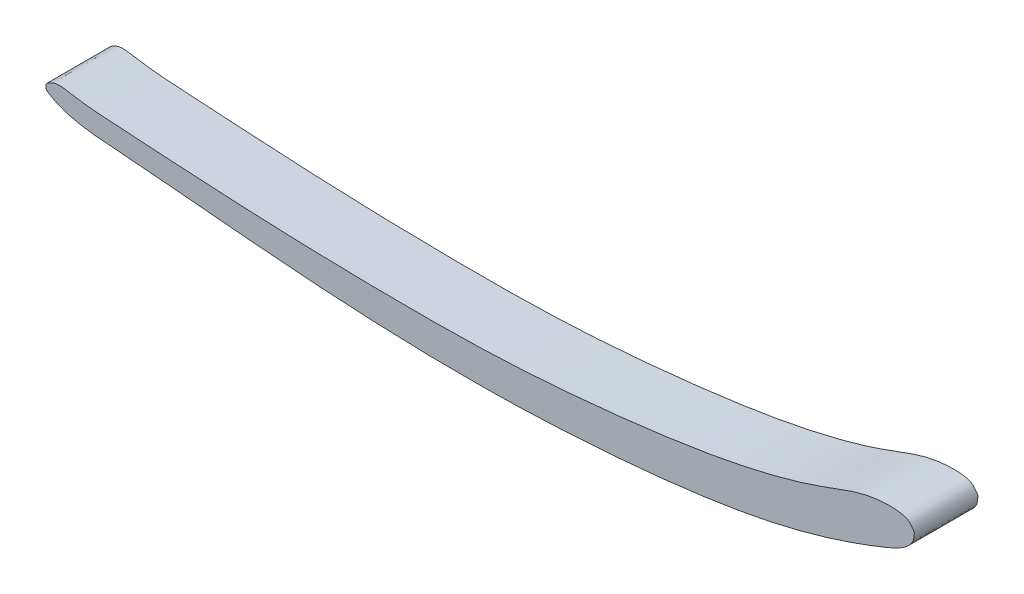
ISO-10303-21;
HEADER;
FILE_DESCRIPTION(('STEP AP214'),'2;1');
FILE_NAME('part.step','',(''),(''),'','','');
FILE_SCHEMA(('AUTOMOTIVE_DESIGN { 1 0 10303 214 1 1 1 1 }'));
ENDSEC;
DATA;
#1=APPLICATION_CONTEXT('core data for automotive mechanical design processes');
#2=APPLICATION_PROTOCOL_DEFINITION('international standard','automotive_design',2000,#1);
#3=PRODUCT_CONTEXT('',#1,'mechanical');
#4=PRODUCT('Part','Part','',(#3));
#5=PRODUCT_RELATED_PRODUCT_CATEGORY('part','',(#4));
#6=PRODUCT_DEFINITION_FORMATION('','',#4);
#7=PRODUCT_DEFINITION_CONTEXT('part definition',#1,'design');
#8=PRODUCT_DEFINITION('design','',#6,#7);
#9=PRODUCT_DEFINITION_SHAPE('','',#8);
#10=(LENGTH_UNIT() NAMED_UNIT(*) SI_UNIT(.MILLI.,.METRE.));
#11=(NAMED_UNIT(*) PLANE_ANGLE_UNIT() SI_UNIT($,.RADIAN.));
#12=(NAMED_UNIT(*) SI_UNIT($,.STERADIAN.) SOLID_ANGLE_UNIT());
#13=UNCERTAINTY_MEASURE_WITH_UNIT(LENGTH_MEASURE(1.E-05),#10,'distance_accuracy_value','');
#14=(GEOMETRIC_REPRESENTATION_CONTEXT(3) GLOBAL_UNCERTAINTY_ASSIGNED_CONTEXT((#13)) GLOBAL_UNIT_ASSIGNED_CONTEXT((#10,
#11,#12)) REPRESENTATION_CONTEXT('',''));
#15=CARTESIAN_POINT('',(0.,0.,0.));
#16=DIRECTION('',(0.,0.,1.));
#17=DIRECTION('',(1.,0.,0.));
#18=AXIS2_PLACEMENT_3D('',#15,#16,#17);
#19=CARTESIAN_POINT('',(36.7262010496488,0.,492.));
#20=CARTESIAN_POINT('',(36.7133797724211,0.0729813604221849,492.));
#21=CARTESIAN_POINT('',(36.67513989734,0.136078291659611,492.));
#22=CARTESIAN_POINT('',(36.5930802891316,0.256964286979581,492.));
#23=CARTESIAN_POINT('',(36.5484626792068,0.314771593384708,492.));
#24=CARTESIAN_POINT('',(36.417875285245,0.490592382841295,492.));
#25=CARTESIAN_POINT('',(36.3318921842273,0.609748889577377,492.));
#26=CARTESIAN_POINT('',(36.1362470533172,0.823987501588429,492.));
#27=CARTESIAN_POINT('',(36.026113092176,0.917294486688997,492.));
#28=CARTESIAN_POINT('',(35.771219217784,1.06506113410336,492.));
#29=CARTESIAN_POINT('',(35.63612750034,1.11829741381301,492.));
#30=CARTESIAN_POINT('',(35.3588698646439,1.20460678963974,492.));
#31=CARTESIAN_POINT('',(35.2158426542222,1.23733972844844,492.));
#32=CARTESIAN_POINT('',(34.9300504604819,1.29113311545856,492.));
#33=CARTESIAN_POINT('',(34.7868633243137,1.31219111687383,492.));
#34=CARTESIAN_POINT('',(34.3565254255757,1.35978754306366,492.));
#35=CARTESIAN_POINT('',(34.0686455554712,1.37169895896495,492.));
#36=CARTESIAN_POINT('',(33.2036087151918,1.37940264309321,492.));
#37=CARTESIAN_POINT('',(32.6222386610464,1.34304315842364,492.));
#38=CARTESIAN_POINT('',(31.4801425739763,1.20827698119862,492.));
#39=CARTESIAN_POINT('',(30.9171817157749,1.10786928119019,492.));
#40=CARTESIAN_POINT('',(29.2517745424601,0.710782667102273,492.));
#41=CARTESIAN_POINT('',(28.1710752271875,0.325189470773035,492.));
#42=CARTESIAN_POINT('',(26.5547430216561,-0.27212932680263,492.));
#43=CARTESIAN_POINT('',(26.0166577938437,-0.473666841823692,492.));
#44=CARTESIAN_POINT('',(24.9370128675374,-0.864537854449624,492.));
#45=CARTESIAN_POINT('',(24.3958332793909,-1.05520648299194,492.));
#46=CARTESIAN_POINT('',(22.7646803572177,-1.60046777293582,492.));
#47=CARTESIAN_POINT('',(21.6668516003385,-1.9274683991486,492.));
#48=CARTESIAN_POINT('',(19.457001129466,-2.53161713828822,492.));
#49=CARTESIAN_POINT('',(18.3451317724488,-2.80930040242567,492.));
#50=CARTESIAN_POINT('',(16.1113814923126,-3.32950148011149,492.));
#51=CARTESIAN_POINT('',(14.9889144466648,-3.57154776048857,492.));
#52=CARTESIAN_POINT('',(12.7352509971393,-4.01780116655661,492.));
#53=CARTESIAN_POINT('',(11.6051903979895,-4.22234051754887,492.));
#54=CARTESIAN_POINT('',(8.20755388742425,-4.7930447372641,492.));
#55=CARTESIAN_POINT('',(5.93270816837034,-5.1183275838422,492.));
#56=CARTESIAN_POINT('',(1.37698305627379,-5.70110088672263,492.));
#57=CARTESIAN_POINT('',(-0.905044220746151,-5.9571115781388,492.));
#58=CARTESIAN_POINT('',(-5.47608147948668,-6.40982049225298,492.));
#59=CARTESIAN_POINT('',(-7.76507349780216,-6.60712892709716,492.));
#60=CARTESIAN_POINT('',(-12.3477937812769,-6.9278693476001,492.));
#61=CARTESIAN_POINT('',(-14.641960047548,-7.04899605573451,492.));
#62=CARTESIAN_POINT('',(-19.2313471286655,-7.20779369924017,492.));
#63=CARTESIAN_POINT('',(-21.5271553841849,-7.24648259675405,492.));
#64=CARTESIAN_POINT('',(-26.1201831567125,-7.27232044630014,492.));
#65=CARTESIAN_POINT('',(-28.4171087602292,-7.26034154270508,492.));
#66=CARTESIAN_POINT('',(-33.0099241994059,-7.20662342549448,492.));
#67=CARTESIAN_POINT('',(-35.3061215876952,-7.16502147347035,492.));
#68=CARTESIAN_POINT('',(-39.8979941578567,-7.04521420327862,492.));
#69=CARTESIAN_POINT('',(-42.1934095141933,-6.9659721273405,492.));
#70=CARTESIAN_POINT('',(-49.0769555280264,-6.6756878402906,492.));
#71=CARTESIAN_POINT('',(-53.6628113274282,-6.40796296634062,492.));
#72=CARTESIAN_POINT('',(-59.39445231446,-6.06671721522193,492.));
#73=CARTESIAN_POINT('',(-60.5407210543964,-5.99747576330353,492.));
#74=CARTESIAN_POINT('',(-62.2599339874662,-5.89050824881909,492.));
#75=CARTESIAN_POINT('',(-62.8329301402781,-5.8536731978304,492.));
#76=CARTESIAN_POINT('',(-63.9788443151999,-5.77884108443333,492.));
#77=CARTESIAN_POINT('',(-64.5518752660169,-5.74255292116659,492.));
#78=CARTESIAN_POINT('',(-65.6974797314219,-5.66299154351626,492.));
#79=CARTESIAN_POINT('',(-66.2698761172291,-5.61897610933982,492.));
#80=CARTESIAN_POINT('',(-67.4110953963833,-5.50216477965581,492.));
#81=CARTESIAN_POINT('',(-67.9797927650533,-5.42793003678991,492.));
#82=CARTESIAN_POINT('',(-69.1125449764886,-5.24103142237363,492.));
#83=CARTESIAN_POINT('',(-69.6763377465336,-5.12201462321532,492.));
#84=CARTESIAN_POINT('',(-70.3892899799784,-5.06426097505116,492.));
#85=CARTESIAN_POINT('',(-70.5323091179331,-5.05757735164672,492.));
#86=CARTESIAN_POINT('',(-70.8199094070894,-5.06194427628034,492.));
#87=CARTESIAN_POINT('',(-70.9657323749074,-5.07338825264403,492.));
#88=CARTESIAN_POINT('',(-71.2477713224917,-5.12390379627729,492.));
#89=CARTESIAN_POINT('',(-71.3844782759016,-5.16440800205834,492.));
#90=CARTESIAN_POINT('',(-71.6502130784592,-5.27256502873785,492.));
#91=CARTESIAN_POINT('',(-71.7802061125209,-5.33787863187121,492.));
#92=CARTESIAN_POINT('',(-71.9694655812472,-5.44422989080409,492.));
#93=CARTESIAN_POINT('',(-72.0327138706296,-5.47968313219667,492.));
#94=CARTESIAN_POINT('',(-72.1248965817004,-5.53658783990071,492.));
#95=CARTESIAN_POINT('',(-72.1547450272689,-5.55681451004528,492.));
#96=CARTESIAN_POINT('',(-72.209366928061,-5.60453250914638,492.));
#97=CARTESIAN_POINT('',(-72.2340820680282,-5.63318494143246,492.));
#98=CARTESIAN_POINT('',(-72.2924392748385,-5.72618514481274,492.));
#99=CARTESIAN_POINT('',(-72.3128511792452,-5.79931584357966,492.));
#100=CARTESIAN_POINT('',(-72.3232724789684,-5.94620827564578,492.));
#101=CARTESIAN_POINT('',(-72.3194729880737,-6.02037282297193,492.));
#102=CARTESIAN_POINT('',(-72.3073433554358,-6.16678710597583,492.));
#103=CARTESIAN_POINT('',(-72.2960879904276,-6.24107832333309,492.));
#104=CARTESIAN_POINT('',(-72.2529271733587,-6.34387914655428,492.));
#105=CARTESIAN_POINT('',(-72.2339038151388,-6.37662583625055,492.));
#106=CARTESIAN_POINT('',(-72.1852803225318,-6.43305369071682,492.));
#107=CARTESIAN_POINT('',(-72.1566201468351,-6.45689915138685,492.));
#108=CARTESIAN_POINT('',(-72.0645871562647,-6.52100202513553,492.));
#109=CARTESIAN_POINT('',(-71.9973345991958,-6.55326933618474,492.));
#110=CARTESIAN_POINT('',(-71.8653447752185,-6.62226874965908,492.));
#111=CARTESIAN_POINT('',(-71.8003441060631,-6.65853329724755,492.));
#112=CARTESIAN_POINT('',(-71.6068389992752,-6.76998402878294,492.));
#113=CARTESIAN_POINT('',(-71.4798062473522,-6.84820703957239,492.));
#114=CARTESIAN_POINT('',(-71.2229969001249,-6.99891261616082,492.));
#115=CARTESIAN_POINT('',(-71.09264775562,-7.06988767577825,492.));
#116=CARTESIAN_POINT('',(-70.6930560851211,-7.26357659275841,492.));
#117=CARTESIAN_POINT('',(-70.4170256848119,-7.37100841520982,492.));
#118=CARTESIAN_POINT('',(-69.8554019439027,-7.56434231742882,492.));
#119=CARTESIAN_POINT('',(-69.5693284535494,-7.65090194172303,492.));
#120=CARTESIAN_POINT('',(-68.9961028679899,-7.80423303785446,492.));
#121=CARTESIAN_POINT('',(-68.7081700693623,-7.87110286877489,492.));
#122=CARTESIAN_POINT('',(-67.8410240006993,-8.04686939913117,492.));
#123=CARTESIAN_POINT('',(-67.2585255746495,-8.13138707089148,492.));
#124=CARTESIAN_POINT('',(-66.0897616207517,-8.27246688396162,492.));
#125=CARTESIAN_POINT('',(-65.5034630773655,-8.32878401811952,492.));
#126=CARTESIAN_POINT('',(-64.3293656553721,-8.43028435133014,492.));
#127=CARTESIAN_POINT('',(-63.7416806505301,-8.47631260360354,492.));
#128=CARTESIAN_POINT('',(-61.9781855162873,-8.61113124742806,492.));
#129=CARTESIAN_POINT('',(-60.8022675303859,-8.69897786281144,492.));
#130=CARTESIAN_POINT('',(-57.2762797832662,-8.98261331393062,492.));
#131=CARTESIAN_POINT('',(-54.9276024583799,-9.19593057339605,492.));
#132=CARTESIAN_POINT('',(-50.2304589700187,-9.62445450304175,492.));
#133=CARTESIAN_POINT('',(-47.8818973024028,-9.83883279038151,492.));
#134=CARTESIAN_POINT('',(-40.8318587061873,-10.431710351713,492.));
#135=CARTESIAN_POINT('',(-36.1261639676439,-10.7609409395558,492.));
#136=CARTESIAN_POINT('',(-26.7036833257857,-11.1904512676192,492.));
#137=CARTESIAN_POINT('',(-21.986751810886,-11.2939342214098,492.));
#138=CARTESIAN_POINT('',(-12.5557765174126,-11.2060826570774,492.));
#139=CARTESIAN_POINT('',(-7.84093091966973,-11.0114473958237,492.));
#140=CARTESIAN_POINT('',(-0.785320613785473,-10.5086414816244,492.));
#141=CARTESIAN_POINT('',(1.56526053661073,-10.3056462427037,492.));
#142=CARTESIAN_POINT('',(6.25618945869852,-9.82487260858937,492.));
#143=CARTESIAN_POINT('',(8.59696899828266,-9.54725947275499,492.));
#144=CARTESIAN_POINT('',(13.2644761374769,-8.88037668744046,492.));
#145=CARTESIAN_POINT('',(15.5933352344576,-8.4910307309868,492.));
#146=CARTESIAN_POINT('',(20.2139385129581,-7.5457783292045,492.));
#147=CARTESIAN_POINT('',(22.5082008971532,-6.9860885791373,492.));
#148=CARTESIAN_POINT('',(27.0374312138603,-5.66483699122295,492.));
#149=CARTESIAN_POINT('',(29.2733048666094,-4.90335386497508,492.));
#150=CARTESIAN_POINT('',(32.0314837674947,-3.85732114832945,492.));
#151=CARTESIAN_POINT('',(32.5815062879098,-3.64356768469349,492.));
#152=CARTESIAN_POINT('',(33.3993190400801,-3.30540064756832,492.));
#153=CARTESIAN_POINT('',(33.6703943712711,-3.18923687375497,492.));
#154=CARTESIAN_POINT('',(34.2069639012786,-2.94434681684933,492.));
#155=CARTESIAN_POINT('',(34.4733575904017,-2.81598081880883,492.));
#156=CARTESIAN_POINT('',(34.9916494511295,-2.53720482629325,492.));
#157=CARTESIAN_POINT('',(35.2434384528101,-2.38660069014345,492.));
#158=CARTESIAN_POINT('',(35.722006187157,-2.0472625557671,492.));
#159=CARTESIAN_POINT('',(35.9504620101233,-1.85501034270215,492.));
#160=CARTESIAN_POINT('',(36.2506621302016,-1.5277247154602,492.));
#161=CARTESIAN_POINT('',(36.3440037389118,-1.41287380451737,492.));
#162=CARTESIAN_POINT('',(36.5068422641124,-1.16276440793578,492.));
#163=CARTESIAN_POINT('',(36.5743745085188,-1.03126283993901,492.));
#164=CARTESIAN_POINT('',(36.6592988621814,-0.747215015619838,492.));
#165=CARTESIAN_POINT('',(36.6721568019822,-0.595707105208426,492.));
#166=CARTESIAN_POINT('',(36.6927489836609,-0.372351500355764,492.));
#167=CARTESIAN_POINT('',(36.7026695849396,-0.298224068369563,492.));
#168=CARTESIAN_POINT('',(36.7192654040829,-0.187214950157583,492.));
#169=CARTESIAN_POINT('',(36.7251427815422,-0.150248577218497,492.));
#170=CARTESIAN_POINT('',(36.7320624155242,-0.0758026077712602,492.));
#171=CARTESIAN_POINT('',(36.7326116882626,-0.036490680211089,492.));
#172=CARTESIAN_POINT('',(36.7262010496488,0.,492.));
#173=B_SPLINE_CURVE_WITH_KNOTS('',3,(#19,#20,#21,#22,#23,#24,#25,#26,#27,#28,#29,#30,#31,#32,
#33,#34,#35,#36,#37,#38,#39,#40,#41,#42,#43,#44,#45,#46,#47,#48,#49,#50,#51,#52,#53,#54,#55,#56,
#57,#58,#59,#60,#61,#62,#63,#64,#65,#66,#67,#68,#69,#70,#71,#72,#73,#74,#75,#76,#77,#78,#79,#80,
#81,#82,#83,#84,#85,#86,#87,#88,#89,#90,#91,#92,#93,#94,#95,#96,#97,#98,#99,#100,#101,#102,#103,
#104,#105,#106,#107,#108,#109,#110,#111,#112,#113,#114,#115,#116,#117,#118,#119,#120,#121,#122,
#123,#124,#125,#126,#127,#128,#129,#130,#131,#132,#133,#134,#135,#136,#137,#138,#139,#140,#141,
#142,#143,#144,#145,#146,#147,#148,#149,#150,#151,#152,#153,#154,#155,#156,#157,#158,#159,#160,
#161,#162,#163,#164,#165,#166,#167,#168,#169,#170,#171,#172),.UNSPECIFIED.,.T.,.F.,(4,2,2,2,2,2,
2,2,2,2,2,2,2,2,2,2,2,2,2,2,2,2,2,2,2,2,2,2,2,2,2,2,2,2,2,2,2,2,2,2,2,2,2,2,2,2,2,2,2,2,2,2,2,2,
2,2,2,2,2,2,2,2,2,2,2,2,2,2,2,2,2,2,2,2,2,2,4),(0.,0.000976562499999904,0.00195312499999981,
0.00390624999999962,0.00585937499999942,0.00781249999999923,0.00976562499999904,
0.0117187499999988,0.0156249999999984,0.0234374999999974,0.0312499999999965,0.0468749999999946,
0.0546874999999937,0.0624999999999927,0.0781249999999909,0.0937499999999891,0.109374999999987,
0.124999999999986,0.156249999999982,0.187499999999978,0.218749999999975,0.249999999999971,
0.281249999999968,0.312499999999964,0.343749999999961,0.374999999999957,0.43749999999995,
0.453124999999948,0.460937499999947,0.468749999999946,0.476562499999945,0.484374999999944,
0.492187499999943,0.494140624999943,0.496093749999943,0.498046874999943,0.499999999999943,
0.500976562499942,0.501464843749943,0.501953124999943,0.502929687499943,0.503906249999943,
0.504882812499943,0.505371093749943,0.505859374999943,0.506835937499943,0.507812499999943,
0.509765624999943,0.511718749999943,0.515624999999944,0.519531249999944,0.523437499999945,
0.531249999999946,0.539062499999947,0.546874999999948,0.562499999999949,0.593749999999953,
0.624999999999957,0.687499999999964,0.749999999999971,0.812499999999978,0.843749999999982,
0.874999999999985,0.906249999999989,0.937499999999993,0.968749999999996,0.976562499999997,
0.980468749999998,0.984374999999998,0.988281249999999,0.992187499999999,0.994140624999999,
0.99609375,0.998046875,0.9990234375,0.99951171875,1.),.UNSPECIFIED.);
#174=DIRECTION('',(0.,0.,-1.));
#175=VECTOR('',#174,1.);
#176=SURFACE_OF_LINEAR_EXTRUSION('',#173,#175);
#177=CARTESIAN_POINT('',(36.7262010496488,0.,492.));
#178=CARTESIAN_POINT('',(36.7326116882626,-0.036490680211089,492.));
#179=CARTESIAN_POINT('',(36.7320624155242,-0.0758026077712602,492.));
#180=CARTESIAN_POINT('',(36.7251427815422,-0.150248577218497,492.));
#181=CARTESIAN_POINT('',(36.7192654040829,-0.187214950157583,492.));
#182=CARTESIAN_POINT('',(36.7026695849396,-0.298224068369563,492.));
#183=CARTESIAN_POINT('',(36.6927489836609,-0.372351500355764,492.));
#184=CARTESIAN_POINT('',(36.6721568019822,-0.595707105208426,492.));
#185=CARTESIAN_POINT('',(36.6592988621814,-0.747215015619838,492.));
#186=CARTESIAN_POINT('',(36.5743745085188,-1.03126283993901,492.));
#187=CARTESIAN_POINT('',(36.5068422641124,-1.16276440793578,492.));
#188=CARTESIAN_POINT('',(36.3440037389118,-1.41287380451737,492.));
#189=CARTESIAN_POINT('',(36.2506621302016,-1.5277247154602,492.));
#190=CARTESIAN_POINT('',(35.9504620101233,-1.85501034270215,492.));
#191=CARTESIAN_POINT('',(35.722006187157,-2.0472625557671,492.));
#192=CARTESIAN_POINT('',(35.2434384528101,-2.38660069014345,492.));
#193=CARTESIAN_POINT('',(34.9916494511295,-2.53720482629325,492.));
#194=CARTESIAN_POINT('',(34.4733575904017,-2.81598081880883,492.));
#195=CARTESIAN_POINT('',(34.2069639012786,-2.94434681684933,492.));
#196=CARTESIAN_POINT('',(33.6703943712711,-3.18923687375497,492.));
#197=CARTESIAN_POINT('',(33.3993190400801,-3.30540064756832,492.));
#198=CARTESIAN_POINT('',(32.5815062879098,-3.64356768469349,492.));
#199=CARTESIAN_POINT('',(32.0314837674947,-3.85732114832945,492.));
#200=CARTESIAN_POINT('',(29.2733048666094,-4.90335386497508,492.));
#201=CARTESIAN_POINT('',(27.0374312138603,-5.66483699122295,492.));
#202=CARTESIAN_POINT('',(22.5082008971532,-6.9860885791373,492.));
#203=CARTESIAN_POINT('',(20.2139385129581,-7.5457783292045,492.));
#204=CARTESIAN_POINT('',(15.5933352344576,-8.4910307309868,492.));
#205=CARTESIAN_POINT('',(13.2644761374769,-8.88037668744046,492.));
#206=CARTESIAN_POINT('',(8.59696899828266,-9.54725947275499,492.));
#207=CARTESIAN_POINT('',(6.25618945869852,-9.82487260858937,492.));
#208=CARTESIAN_POINT('',(1.56526053661073,-10.3056462427037,492.));
#209=CARTESIAN_POINT('',(-0.785320613785473,-10.5086414816244,492.));
#210=CARTESIAN_POINT('',(-7.84093091966973,-11.0114473958237,492.));
#211=CARTESIAN_POINT('',(-12.5557765174126,-11.2060826570774,492.));
#212=CARTESIAN_POINT('',(-21.986751810886,-11.2939342214098,492.));
#213=CARTESIAN_POINT('',(-26.7036833257857,-11.1904512676192,492.));
#214=CARTESIAN_POINT('',(-36.1261639676439,-10.7609409395558,492.));
#215=CARTESIAN_POINT('',(-40.8318587061873,-10.431710351713,492.));
#216=CARTESIAN_POINT('',(-47.8818973024028,-9.83883279038151,492.));
#217=CARTESIAN_POINT('',(-50.2304589700187,-9.62445450304175,492.));
#218=CARTESIAN_POINT('',(-54.9276024583799,-9.19593057339605,492.));
#219=CARTESIAN_POINT('',(-57.2762797832662,-8.98261331393062,492.));
#220=CARTESIAN_POINT('',(-60.8022675303859,-8.69897786281144,492.));
#221=CARTESIAN_POINT('',(-61.9781855162873,-8.61113124742806,492.));
#222=CARTESIAN_POINT('',(-63.7416806505301,-8.47631260360354,492.));
#223=CARTESIAN_POINT('',(-64.3293656553721,-8.43028435133014,492.));
#224=CARTESIAN_POINT('',(-65.5034630773655,-8.32878401811952,492.));
#225=CARTESIAN_POINT('',(-66.0897616207517,-8.27246688396162,492.));
#226=CARTESIAN_POINT('',(-67.2585255746495,-8.13138707089148,492.));
#227=CARTESIAN_POINT('',(-67.8410240006993,-8.04686939913117,492.));
#228=CARTESIAN_POINT('',(-68.7081700693623,-7.87110286877489,492.));
#229=CARTESIAN_POINT('',(-68.9961028679899,-7.80423303785446,492.));
#230=CARTESIAN_POINT('',(-69.5693284535494,-7.65090194172303,492.));
#231=CARTESIAN_POINT('',(-69.8554019439027,-7.56434231742882,492.));
#232=CARTESIAN_POINT('',(-70.4170256848119,-7.37100841520982,492.));
#233=CARTESIAN_POINT('',(-70.6930560851211,-7.26357659275841,492.));
#234=CARTESIAN_POINT('',(-71.09264775562,-7.06988767577825,492.));
#235=CARTESIAN_POINT('',(-71.2229969001249,-6.99891261616082,492.));
#236=CARTESIAN_POINT('',(-71.4798062473522,-6.84820703957239,492.));
#237=CARTESIAN_POINT('',(-71.6068389992752,-6.76998402878294,492.));
#238=CARTESIAN_POINT('',(-71.8003441060631,-6.65853329724755,492.));
#239=CARTESIAN_POINT('',(-71.8653447752185,-6.62226874965908,492.));
#240=CARTESIAN_POINT('',(-71.9973345991958,-6.55326933618474,492.));
#241=CARTESIAN_POINT('',(-72.0645871562647,-6.52100202513553,492.));
#242=CARTESIAN_POINT('',(-72.1566201468351,-6.45689915138685,492.));
#243=CARTESIAN_POINT('',(-72.1852803225318,-6.43305369071682,492.));
#244=CARTESIAN_POINT('',(-72.2339038151388,-6.37662583625055,492.));
#245=CARTESIAN_POINT('',(-72.2529271733587,-6.34387914655428,492.));
#246=CARTESIAN_POINT('',(-72.2960879904276,-6.24107832333309,492.));
#247=CARTESIAN_POINT('',(-72.3073433554358,-6.16678710597583,492.));
#248=CARTESIAN_POINT('',(-72.3194729880737,-6.02037282297193,492.));
#249=CARTESIAN_POINT('',(-72.3232724789684,-5.94620827564578,492.));
#250=CARTESIAN_POINT('',(-72.3128511792452,-5.79931584357966,492.));
#251=CARTESIAN_POINT('',(-72.2924392748385,-5.72618514481274,492.));
#252=CARTESIAN_POINT('',(-72.2340820680282,-5.63318494143246,492.));
#253=CARTESIAN_POINT('',(-72.209366928061,-5.60453250914638,492.));
#254=CARTESIAN_POINT('',(-72.1547450272689,-5.55681451004528,492.));
#255=CARTESIAN_POINT('',(-72.1248965817004,-5.53658783990071,492.));
#256=CARTESIAN_POINT('',(-72.0327138706296,-5.47968313219667,492.));
#257=CARTESIAN_POINT('',(-71.9694655812472,-5.44422989080409,492.));
#258=CARTESIAN_POINT('',(-71.7802061125209,-5.33787863187121,492.));
#259=CARTESIAN_POINT('',(-71.6502130784592,-5.27256502873785,492.));
#260=CARTESIAN_POINT('',(-71.3844782759016,-5.16440800205834,492.));
#261=CARTESIAN_POINT('',(-71.2477713224917,-5.12390379627729,492.));
#262=CARTESIAN_POINT('',(-70.9657323749074,-5.07338825264403,492.));
#263=CARTESIAN_POINT('',(-70.8199094070894,-5.06194427628034,492.));
#264=CARTESIAN_POINT('',(-70.5323091179331,-5.05757735164672,492.));
#265=CARTESIAN_POINT('',(-70.3892899799784,-5.06426097505116,492.));
#266=CARTESIAN_POINT('',(-69.6763377465336,-5.12201462321532,492.));
#267=CARTESIAN_POINT('',(-69.1125449764886,-5.24103142237363,492.));
#268=CARTESIAN_POINT('',(-67.9797927650533,-5.42793003678991,492.));
#269=CARTESIAN_POINT('',(-67.4110953963833,-5.50216477965581,492.));
#270=CARTESIAN_POINT('',(-66.2698761172291,-5.61897610933982,492.));
#271=CARTESIAN_POINT('',(-65.6974797314219,-5.66299154351626,492.));
#272=CARTESIAN_POINT('',(-64.5518752660169,-5.74255292116659,492.));
#273=CARTESIAN_POINT('',(-63.9788443151999,-5.77884108443333,492.));
#274=CARTESIAN_POINT('',(-62.8329301402781,-5.8536731978304,492.));
#275=CARTESIAN_POINT('',(-62.2599339874662,-5.89050824881909,492.));
#276=CARTESIAN_POINT('',(-60.5407210543964,-5.99747576330353,492.));
#277=CARTESIAN_POINT('',(-59.39445231446,-6.06671721522193,492.));
#278=CARTESIAN_POINT('',(-53.6628113274282,-6.40796296634062,492.));
#279=CARTESIAN_POINT('',(-49.0769555280264,-6.6756878402906,492.));
#280=CARTESIAN_POINT('',(-42.1934095141933,-6.9659721273405,492.));
#281=CARTESIAN_POINT('',(-39.8979941578567,-7.04521420327862,492.));
#282=CARTESIAN_POINT('',(-35.3061215876952,-7.16502147347035,492.));
#283=CARTESIAN_POINT('',(-33.0099241994059,-7.20662342549448,492.));
#284=CARTESIAN_POINT('',(-28.4171087602292,-7.26034154270508,492.));
#285=CARTESIAN_POINT('',(-26.1201831567125,-7.27232044630014,492.));
#286=CARTESIAN_POINT('',(-21.5271553841849,-7.24648259675405,492.));
#287=CARTESIAN_POINT('',(-19.2313471286655,-7.20779369924017,492.));
#288=CARTESIAN_POINT('',(-14.641960047548,-7.04899605573451,492.));
#289=CARTESIAN_POINT('',(-12.3477937812769,-6.9278693476001,492.));
#290=CARTESIAN_POINT('',(-7.76507349780216,-6.60712892709716,492.));
#291=CARTESIAN_POINT('',(-5.47608147948668,-6.40982049225298,492.));
#292=CARTESIAN_POINT('',(-0.905044220746151,-5.9571115781388,492.));
#293=CARTESIAN_POINT('',(1.37698305627379,-5.70110088672263,492.));
#294=CARTESIAN_POINT('',(5.93270816837034,-5.1183275838422,492.));
#295=CARTESIAN_POINT('',(8.20755388742425,-4.7930447372641,492.));
#296=CARTESIAN_POINT('',(11.6051903979895,-4.22234051754887,492.));
#297=CARTESIAN_POINT('',(12.7352509971393,-4.01780116655661,492.));
#298=CARTESIAN_POINT('',(14.9889144466648,-3.57154776048857,492.));
#299=CARTESIAN_POINT('',(16.1113814923126,-3.32950148011149,492.));
#300=CARTESIAN_POINT('',(18.3451317724488,-2.80930040242567,492.));
#301=CARTESIAN_POINT('',(19.457001129466,-2.53161713828822,492.));
#302=CARTESIAN_POINT('',(21.6668516003385,-1.9274683991486,492.));
#303=CARTESIAN_POINT('',(22.7646803572177,-1.60046777293582,492.));
#304=CARTESIAN_POINT('',(24.3958332793909,-1.05520648299194,492.));
#305=CARTESIAN_POINT('',(24.9370128675374,-0.864537854449624,492.));
#306=CARTESIAN_POINT('',(26.0166577938437,-0.473666841823692,492.));
#307=CARTESIAN_POINT('',(26.5547430216561,-0.27212932680263,492.));
#308=CARTESIAN_POINT('',(28.1710752271875,0.325189470773035,492.));
#309=CARTESIAN_POINT('',(29.2517745424601,0.710782667102273,492.));
#310=CARTESIAN_POINT('',(30.9171817157749,1.10786928119019,492.));
#311=CARTESIAN_POINT('',(31.4801425739763,1.20827698119862,492.));
#312=CARTESIAN_POINT('',(32.6222386610464,1.34304315842364,492.));
#313=CARTESIAN_POINT('',(33.2036087151918,1.37940264309321,492.));
#314=CARTESIAN_POINT('',(34.0686455554712,1.37169895896495,492.));
#315=CARTESIAN_POINT('',(34.3565254255757,1.35978754306366,492.));
#316=CARTESIAN_POINT('',(34.7868633243137,1.31219111687383,492.));
#317=CARTESIAN_POINT('',(34.9300504604819,1.29113311545856,492.));
#318=CARTESIAN_POINT('',(35.2158426542222,1.23733972844844,492.));
#319=CARTESIAN_POINT('',(35.3588698646439,1.20460678963974,492.));
#320=CARTESIAN_POINT('',(35.63612750034,1.11829741381301,492.));
#321=CARTESIAN_POINT('',(35.771219217784,1.06506113410336,492.));
#322=CARTESIAN_POINT('',(36.026113092176,0.917294486688997,492.));
#323=CARTESIAN_POINT('',(36.1362470533172,0.823987501588429,492.));
#324=CARTESIAN_POINT('',(36.3318921842273,0.609748889577377,492.));
#325=CARTESIAN_POINT('',(36.417875285245,0.490592382841295,492.));
#326=CARTESIAN_POINT('',(36.5484626792068,0.314771593384708,492.));
#327=CARTESIAN_POINT('',(36.5930802891316,0.256964286979581,492.));
#328=CARTESIAN_POINT('',(36.67513989734,0.136078291659611,492.));
#329=CARTESIAN_POINT('',(36.7133797724211,0.0729813604221849,492.));
#330=CARTESIAN_POINT('',(36.7262010496488,0.,492.));
#331=B_SPLINE_CURVE_WITH_KNOTS('',3,(#177,#178,#179,#180,#181,#182,#183,#184,#185,#186,#187,
#188,#189,#190,#191,#192,#193,#194,#195,#196,#197,#198,#199,#200,#201,#202,#203,#204,#205,#206,
#207,#208,#209,#210,#211,#212,#213,#214,#215,#216,#217,#218,#219,#220,#221,#222,#223,#224,#225,
#226,#227,#228,#229,#230,#231,#232,#233,#234,#235,#236,#237,#238,#239,#240,#241,#242,#243,#244,
#245,#246,#247,#248,#249,#250,#251,#252,#253,#254,#255,#256,#257,#258,#259,#260,#261,#262,#263,
#264,#265,#266,#267,#268,#269,#270,#271,#272,#273,#274,#275,#276,#277,#278,#279,#280,#281,#282,
#283,#284,#285,#286,#287,#288,#289,#290,#291,#292,#293,#294,#295,#296,#297,#298,#299,#300,#301,
#302,#303,#304,#305,#306,#307,#308,#309,#310,#311,#312,#313,#314,#315,#316,#317,#318,#319,#320,
#321,#322,#323,#324,#325,#326,#327,#328,#329,#330),.UNSPECIFIED.,.T.,.F.,(4,2,2,2,2,2,2,2,2,2,2,
2,2,2,2,2,2,2,2,2,2,2,2,2,2,2,2,2,2,2,2,2,2,2,2,2,2,2,2,2,2,2,2,2,2,2,2,2,2,2,2,2,2,2,2,2,2,2,2,
2,2,2,2,2,2,2,2,2,2,2,2,2,2,2,2,2,4),(0.,0.00048828125,0.0009765625,0.00195312500000011,
0.00390625000000044,0.00585937500000067,0.00781250000000089,0.0117187500000014,
0.0156250000000019,0.0195312500000024,0.0234375000000029,0.0312500000000038,0.0625000000000074,
0.093750000000011,0.125000000000015,0.156250000000018,0.187500000000022,0.250000000000029,
0.312500000000036,0.375000000000043,0.406250000000047,0.437500000000051,0.453125000000052,
0.460937500000053,0.468750000000054,0.476562500000055,0.480468750000056,0.484375000000056,
0.488281250000057,0.490234375000057,0.492187500000057,0.493164062500057,0.494140625000057,
0.494628906250057,0.495117187500057,0.496093750000057,0.497070312500057,0.498046875000057,
0.498535156250057,0.499023437500058,0.500000000000057,0.501953125000057,0.503906250000057,
0.505859375000057,0.507812500000057,0.515625000000056,0.523437500000055,0.531250000000054,
0.539062500000053,0.546875000000052,0.56250000000005,0.625000000000043,0.656250000000039,
0.687500000000036,0.718750000000032,0.750000000000029,0.781250000000025,0.812500000000022,
0.843750000000018,0.875000000000014,0.890625000000013,0.906250000000011,0.921875000000009,
0.937500000000007,0.945312500000006,0.953125000000005,0.968750000000004,0.976562500000003,
0.984375000000002,0.988281250000001,0.990234375000001,0.992187500000001,0.994140625000001,
0.99609375,0.998046875,0.9990234375,1.),.UNSPECIFIED.);
#332=CARTESIAN_POINT('',(36.7262010496488,0.,492.));
#333=VERTEX_POINT('',#332);
#334=EDGE_CURVE('E10',#333,#333,#331,.F.);
#335=ORIENTED_EDGE('',*,*,#334,.F.);
#336=EDGE_LOOP('',(#335));
#337=FACE_BOUND('',#336,.T.);
#338=CARTESIAN_POINT('',(36.7262010496488,0.,484.));
#339=CARTESIAN_POINT('',(36.7133797724211,0.0729813604221849,484.));
#340=CARTESIAN_POINT('',(36.67513989734,0.136078291659611,484.));
#341=CARTESIAN_POINT('',(36.5930802891316,0.256964286979581,484.));
#342=CARTESIAN_POINT('',(36.5484626792068,0.314771593384708,484.));
#343=CARTESIAN_POINT('',(36.417875285245,0.490592382841295,484.));
#344=CARTESIAN_POINT('',(36.3318921842273,0.609748889577377,484.));
#345=CARTESIAN_POINT('',(36.1362470533172,0.823987501588429,484.));
#346=CARTESIAN_POINT('',(36.026113092176,0.917294486688997,484.));
#347=CARTESIAN_POINT('',(35.771219217784,1.06506113410336,484.));
#348=CARTESIAN_POINT('',(35.63612750034,1.11829741381301,484.));
#349=CARTESIAN_POINT('',(35.3588698646439,1.20460678963974,484.));
#350=CARTESIAN_POINT('',(35.2158426542222,1.23733972844844,484.));
#351=CARTESIAN_POINT('',(34.9300504604819,1.29113311545856,484.));
#352=CARTESIAN_POINT('',(34.7868633243137,1.31219111687383,484.));
#353=CARTESIAN_POINT('',(34.3565254255757,1.35978754306366,484.));
#354=CARTESIAN_POINT('',(34.0686455554712,1.37169895896495,484.));
#355=CARTESIAN_POINT('',(33.2036087151918,1.37940264309321,484.));
#356=CARTESIAN_POINT('',(32.6222386610464,1.34304315842364,484.));
#357=CARTESIAN_POINT('',(31.4801425739763,1.20827698119862,484.));
#358=CARTESIAN_POINT('',(30.9171817157749,1.10786928119019,484.));
#359=CARTESIAN_POINT('',(29.2517745424601,0.710782667102273,484.));
#360=CARTESIAN_POINT('',(28.1710752271875,0.325189470773035,484.));
#361=CARTESIAN_POINT('',(26.5547430216561,-0.27212932680263,484.));
#362=CARTESIAN_POINT('',(26.0166577938437,-0.473666841823692,484.));
#363=CARTESIAN_POINT('',(24.9370128675374,-0.864537854449624,484.));
#364=CARTESIAN_POINT('',(24.3958332793909,-1.05520648299194,484.));
#365=CARTESIAN_POINT('',(22.7646803572177,-1.60046777293582,484.));
#366=CARTESIAN_POINT('',(21.6668516003385,-1.9274683991486,484.));
#367=CARTESIAN_POINT('',(19.457001129466,-2.53161713828822,484.));
#368=CARTESIAN_POINT('',(18.3451317724488,-2.80930040242567,484.));
#369=CARTESIAN_POINT('',(16.1113814923126,-3.32950148011149,484.));
#370=CARTESIAN_POINT('',(14.9889144466648,-3.57154776048857,484.));
#371=CARTESIAN_POINT('',(12.7352509971393,-4.01780116655661,484.));
#372=CARTESIAN_POINT('',(11.6051903979895,-4.22234051754887,484.));
#373=CARTESIAN_POINT('',(8.20755388742425,-4.7930447372641,484.));
#374=CARTESIAN_POINT('',(5.93270816837034,-5.1183275838422,484.));
#375=CARTESIAN_POINT('',(1.37698305627379,-5.70110088672263,484.));
#376=CARTESIAN_POINT('',(-0.905044220746151,-5.9571115781388,484.));
#377=CARTESIAN_POINT('',(-5.47608147948668,-6.40982049225298,484.));
#378=CARTESIAN_POINT('',(-7.76507349780216,-6.60712892709716,484.));
#379=CARTESIAN_POINT('',(-12.3477937812769,-6.9278693476001,484.));
#380=CARTESIAN_POINT('',(-14.641960047548,-7.04899605573451,484.));
#381=CARTESIAN_POINT('',(-19.2313471286655,-7.20779369924017,484.));
#382=CARTESIAN_POINT('',(-21.5271553841849,-7.24648259675405,484.));
#383=CARTESIAN_POINT('',(-26.1201831567125,-7.27232044630014,484.));
#384=CARTESIAN_POINT('',(-28.4171087602292,-7.26034154270508,484.));
#385=CARTESIAN_POINT('',(-33.0099241994059,-7.20662342549448,484.));
#386=CARTESIAN_POINT('',(-35.3061215876952,-7.16502147347035,484.));
#387=CARTESIAN_POINT('',(-39.8979941578567,-7.04521420327862,484.));
#388=CARTESIAN_POINT('',(-42.1934095141933,-6.9659721273405,484.));
#389=CARTESIAN_POINT('',(-49.0769555280264,-6.6756878402906,484.));
#390=CARTESIAN_POINT('',(-53.6628113274282,-6.40796296634062,484.));
#391=CARTESIAN_POINT('',(-59.39445231446,-6.06671721522193,484.));
#392=CARTESIAN_POINT('',(-60.5407210543964,-5.99747576330353,484.));
#393=CARTESIAN_POINT('',(-62.2599339874662,-5.89050824881909,484.));
#394=CARTESIAN_POINT('',(-62.8329301402781,-5.8536731978304,484.));
#395=CARTESIAN_POINT('',(-63.9788443151999,-5.77884108443333,484.));
#396=CARTESIAN_POINT('',(-64.5518752660169,-5.74255292116659,484.));
#397=CARTESIAN_POINT('',(-65.6974797314219,-5.66299154351626,484.));
#398=CARTESIAN_POINT('',(-66.2698761172291,-5.61897610933982,484.));
#399=CARTESIAN_POINT('',(-67.4110953963833,-5.50216477965581,484.));
#400=CARTESIAN_POINT('',(-67.9797927650533,-5.42793003678991,484.));
#401=CARTESIAN_POINT('',(-69.1125449764886,-5.24103142237363,484.));
#402=CARTESIAN_POINT('',(-69.6763377465336,-5.12201462321532,484.));
#403=CARTESIAN_POINT('',(-70.3892899799784,-5.06426097505116,484.));
#404=CARTESIAN_POINT('',(-70.5323091179331,-5.05757735164672,484.));
#405=CARTESIAN_POINT('',(-70.8199094070894,-5.06194427628034,484.));
#406=CARTESIAN_POINT('',(-70.9657323749074,-5.07338825264403,484.));
#407=CARTESIAN_POINT('',(-71.2477713224917,-5.12390379627729,484.));
#408=CARTESIAN_POINT('',(-71.3844782759016,-5.16440800205834,484.));
#409=CARTESIAN_POINT('',(-71.6502130784592,-5.27256502873785,484.));
#410=CARTESIAN_POINT('',(-71.7802061125209,-5.33787863187121,484.));
#411=CARTESIAN_POINT('',(-71.9694655812472,-5.44422989080409,484.));
#412=CARTESIAN_POINT('',(-72.0327138706296,-5.47968313219667,484.));
#413=CARTESIAN_POINT('',(-72.1248965817004,-5.53658783990071,484.));
#414=CARTESIAN_POINT('',(-72.1547450272689,-5.55681451004528,484.));
#415=CARTESIAN_POINT('',(-72.209366928061,-5.60453250914638,484.));
#416=CARTESIAN_POINT('',(-72.2340820680282,-5.63318494143246,484.));
#417=CARTESIAN_POINT('',(-72.2924392748385,-5.72618514481274,484.));
#418=CARTESIAN_POINT('',(-72.3128511792452,-5.79931584357966,484.));
#419=CARTESIAN_POINT('',(-72.3232724789684,-5.94620827564578,484.));
#420=CARTESIAN_POINT('',(-72.3194729880737,-6.02037282297193,484.));
#421=CARTESIAN_POINT('',(-72.3073433554358,-6.16678710597583,484.));
#422=CARTESIAN_POINT('',(-72.2960879904276,-6.24107832333309,484.));
#423=CARTESIAN_POINT('',(-72.2529271733587,-6.34387914655428,484.));
#424=CARTESIAN_POINT('',(-72.2339038151388,-6.37662583625055,484.));
#425=CARTESIAN_POINT('',(-72.1852803225318,-6.43305369071682,484.));
#426=CARTESIAN_POINT('',(-72.1566201468351,-6.45689915138685,484.));
#427=CARTESIAN_POINT('',(-72.0645871562647,-6.52100202513553,484.));
#428=CARTESIAN_POINT('',(-71.9973345991958,-6.55326933618474,484.));
#429=CARTESIAN_POINT('',(-71.8653447752185,-6.62226874965908,484.));
#430=CARTESIAN_POINT('',(-71.8003441060631,-6.65853329724755,484.));
#431=CARTESIAN_POINT('',(-71.6068389992752,-6.76998402878294,484.));
#432=CARTESIAN_POINT('',(-71.4798062473522,-6.84820703957239,484.));
#433=CARTESIAN_POINT('',(-71.2229969001249,-6.99891261616082,484.));
#434=CARTESIAN_POINT('',(-71.09264775562,-7.06988767577825,484.));
#435=CARTESIAN_POINT('',(-70.6930560851211,-7.26357659275841,484.));
#436=CARTESIAN_POINT('',(-70.4170256848119,-7.37100841520982,484.));
#437=CARTESIAN_POINT('',(-69.8554019439027,-7.56434231742882,484.));
#438=CARTESIAN_POINT('',(-69.5693284535494,-7.65090194172303,484.));
#439=CARTESIAN_POINT('',(-68.9961028679899,-7.80423303785446,484.));
#440=CARTESIAN_POINT('',(-68.7081700693623,-7.87110286877489,484.));
#441=CARTESIAN_POINT('',(-67.8410240006993,-8.04686939913117,484.));
#442=CARTESIAN_POINT('',(-67.2585255746495,-8.13138707089148,484.));
#443=CARTESIAN_POINT('',(-66.0897616207517,-8.27246688396162,484.));
#444=CARTESIAN_POINT('',(-65.5034630773655,-8.32878401811952,484.));
#445=CARTESIAN_POINT('',(-64.3293656553721,-8.43028435133014,484.));
#446=CARTESIAN_POINT('',(-63.7416806505301,-8.47631260360354,484.));
#447=CARTESIAN_POINT('',(-61.9781855162873,-8.61113124742806,484.));
#448=CARTESIAN_POINT('',(-60.8022675303859,-8.69897786281144,484.));
#449=CARTESIAN_POINT('',(-57.2762797832662,-8.98261331393062,484.));
#450=CARTESIAN_POINT('',(-54.9276024583799,-9.19593057339605,484.));
#451=CARTESIAN_POINT('',(-50.2304589700187,-9.62445450304175,484.));
#452=CARTESIAN_POINT('',(-47.8818973024028,-9.83883279038151,484.));
#453=CARTESIAN_POINT('',(-40.8318587061873,-10.431710351713,484.));
#454=CARTESIAN_POINT('',(-36.1261639676439,-10.7609409395558,484.));
#455=CARTESIAN_POINT('',(-26.7036833257857,-11.1904512676192,484.));
#456=CARTESIAN_POINT('',(-21.986751810886,-11.2939342214098,484.));
#457=CARTESIAN_POINT('',(-12.5557765174126,-11.2060826570774,484.));
#458=CARTESIAN_POINT('',(-7.84093091966973,-11.0114473958237,484.));
#459=CARTESIAN_POINT('',(-0.785320613785473,-10.5086414816244,484.));
#460=CARTESIAN_POINT('',(1.56526053661073,-10.3056462427037,484.));
#461=CARTESIAN_POINT('',(6.25618945869852,-9.82487260858937,484.));
#462=CARTESIAN_POINT('',(8.59696899828266,-9.54725947275499,484.));
#463=CARTESIAN_POINT('',(13.2644761374769,-8.88037668744046,484.));
#464=CARTESIAN_POINT('',(15.5933352344576,-8.4910307309868,484.));
#465=CARTESIAN_POINT('',(20.2139385129581,-7.5457783292045,484.));
#466=CARTESIAN_POINT('',(22.5082008971532,-6.9860885791373,484.));
#467=CARTESIAN_POINT('',(27.0374312138603,-5.66483699122295,484.));
#468=CARTESIAN_POINT('',(29.2733048666094,-4.90335386497508,484.));
#469=CARTESIAN_POINT('',(32.0314837674947,-3.85732114832945,484.));
#470=CARTESIAN_POINT('',(32.5815062879098,-3.64356768469349,484.));
#471=CARTESIAN_POINT('',(33.3993190400801,-3.30540064756832,484.));
#472=CARTESIAN_POINT('',(33.6703943712711,-3.18923687375497,484.));
#473=CARTESIAN_POINT('',(34.2069639012786,-2.94434681684933,484.));
#474=CARTESIAN_POINT('',(34.4733575904017,-2.81598081880883,484.));
#475=CARTESIAN_POINT('',(34.9916494511295,-2.53720482629325,484.));
#476=CARTESIAN_POINT('',(35.2434384528101,-2.38660069014345,484.));
#477=CARTESIAN_POINT('',(35.722006187157,-2.0472625557671,484.));
#478=CARTESIAN_POINT('',(35.9504620101233,-1.85501034270215,484.));
#479=CARTESIAN_POINT('',(36.2506621302016,-1.5277247154602,484.));
#480=CARTESIAN_POINT('',(36.3440037389118,-1.41287380451737,484.));
#481=CARTESIAN_POINT('',(36.5068422641124,-1.16276440793578,484.));
#482=CARTESIAN_POINT('',(36.5743745085188,-1.03126283993901,484.));
#483=CARTESIAN_POINT('',(36.6592988621814,-0.747215015619838,484.));
#484=CARTESIAN_POINT('',(36.6721568019822,-0.595707105208426,484.));
#485=CARTESIAN_POINT('',(36.6927489836609,-0.372351500355764,484.));
#486=CARTESIAN_POINT('',(36.7026695849396,-0.298224068369563,484.));
#487=CARTESIAN_POINT('',(36.7192654040829,-0.187214950157583,484.));
#488=CARTESIAN_POINT('',(36.7251427815422,-0.150248577218497,484.));
#489=CARTESIAN_POINT('',(36.7320624155242,-0.0758026077712602,484.));
#490=CARTESIAN_POINT('',(36.7326116882626,-0.036490680211089,484.));
#491=CARTESIAN_POINT('',(36.7262010496488,0.,484.));
#492=B_SPLINE_CURVE_WITH_KNOTS('',3,(#338,#339,#340,#341,#342,#343,#344,#345,#346,#347,#348,
#349,#350,#351,#352,#353,#354,#355,#356,#357,#358,#359,#360,#361,#362,#363,#364,#365,#366,#367,
#368,#369,#370,#371,#372,#373,#374,#375,#376,#377,#378,#379,#380,#381,#382,#383,#384,#385,#386,
#387,#388,#389,#390,#391,#392,#393,#394,#395,#396,#397,#398,#399,#400,#401,#402,#403,#404,#405,
#406,#407,#408,#409,#410,#411,#412,#413,#414,#415,#416,#417,#418,#419,#420,#421,#422,#423,#424,
#425,#426,#427,#428,#429,#430,#431,#432,#433,#434,#435,#436,#437,#438,#439,#440,#441,#442,#443,
#444,#445,#446,#447,#448,#449,#450,#451,#452,#453,#454,#455,#456,#457,#458,#459,#460,#461,#462,
#463,#464,#465,#466,#467,#468,#469,#470,#471,#472,#473,#474,#475,#476,#477,#478,#479,#480,#481,
#482,#483,#484,#485,#486,#487,#488,#489,#490,#491),.UNSPECIFIED.,.T.,.F.,(4,2,2,2,2,2,2,2,2,2,2,
2,2,2,2,2,2,2,2,2,2,2,2,2,2,2,2,2,2,2,2,2,2,2,2,2,2,2,2,2,2,2,2,2,2,2,2,2,2,2,2,2,2,2,2,2,2,2,2,
2,2,2,2,2,2,2,2,2,2,2,2,2,2,2,2,2,4),(0.,0.000976562499999904,0.00195312499999981,
0.00390624999999962,0.00585937499999942,0.00781249999999923,0.00976562499999904,
0.0117187499999988,0.0156249999999984,0.0234374999999974,0.0312499999999965,0.0468749999999946,
0.0546874999999937,0.0624999999999927,0.0781249999999909,0.0937499999999891,0.109374999999987,
0.124999999999986,0.156249999999982,0.187499999999978,0.218749999999975,0.249999999999971,
0.281249999999968,0.312499999999964,0.343749999999961,0.374999999999957,0.43749999999995,
0.453124999999948,0.460937499999947,0.468749999999946,0.476562499999945,0.484374999999944,
0.492187499999943,0.494140624999943,0.496093749999943,0.498046874999943,0.499999999999943,
0.500976562499942,0.501464843749943,0.501953124999943,0.502929687499943,0.503906249999943,
0.504882812499943,0.505371093749943,0.505859374999943,0.506835937499943,0.507812499999943,
0.509765624999943,0.511718749999943,0.515624999999944,0.519531249999944,0.523437499999945,
0.531249999999946,0.539062499999947,0.546874999999948,0.562499999999949,0.593749999999953,
0.624999999999957,0.687499999999964,0.749999999999971,0.812499999999978,0.843749999999982,
0.874999999999985,0.906249999999989,0.937499999999993,0.968749999999996,0.976562499999997,
0.980468749999998,0.984374999999998,0.988281249999999,0.992187499999999,0.994140624999999,
0.99609375,0.998046875,0.9990234375,0.99951171875,1.),.UNSPECIFIED.);
#493=CARTESIAN_POINT('',(36.7262010496488,0.,484.));
#494=VERTEX_POINT('',#493);
#495=EDGE_CURVE('E38',#494,#494,#492,.T.);
#496=ORIENTED_EDGE('',*,*,#495,.T.);
#497=EDGE_LOOP('',(#496));
#498=FACE_BOUND('',#497,.T.);
#499=ADVANCED_FACE('F28',(#337,#498),#176,.F.);
#500=CARTESIAN_POINT('',(-71.9063790916829,-5.40877947116605,492.));
#501=DIRECTION('',(0.,0.,-1.));
#502=DIRECTION('',(-1.,0.,0.));
#503=AXIS2_PLACEMENT_3D('',#500,#501,#502);
#504=PLANE('',#503);
#505=ORIENTED_EDGE('',*,*,#334,.T.);
#506=EDGE_LOOP('',(#505));
#507=FACE_BOUND('',#506,.T.);
#508=ADVANCED_FACE('F69',(#507),#504,.F.);
#509=CARTESIAN_POINT('',(-71.9063790916829,-5.40877947116605,484.));
#510=DIRECTION('',(0.,0.,-1.));
#511=DIRECTION('',(-1.,0.,0.));
#512=AXIS2_PLACEMENT_3D('',#509,#510,#511);
#513=PLANE('',#512);
#514=ORIENTED_EDGE('',*,*,#495,.F.);
#515=EDGE_LOOP('',(#514));
#516=FACE_BOUND('',#515,.T.);
#517=ADVANCED_FACE('F77',(#516),#513,.T.);
#518=CLOSED_SHELL('',(#499,#508,#517));
#519=MANIFOLD_SOLID_BREP('B2',#518);
#520=ADVANCED_BREP_SHAPE_REPRESENTATION('',(#18,#519),#14);
#521=SHAPE_DEFINITION_REPRESENTATION(#9,#520);
ENDSEC;
END-ISO-10303-21;
